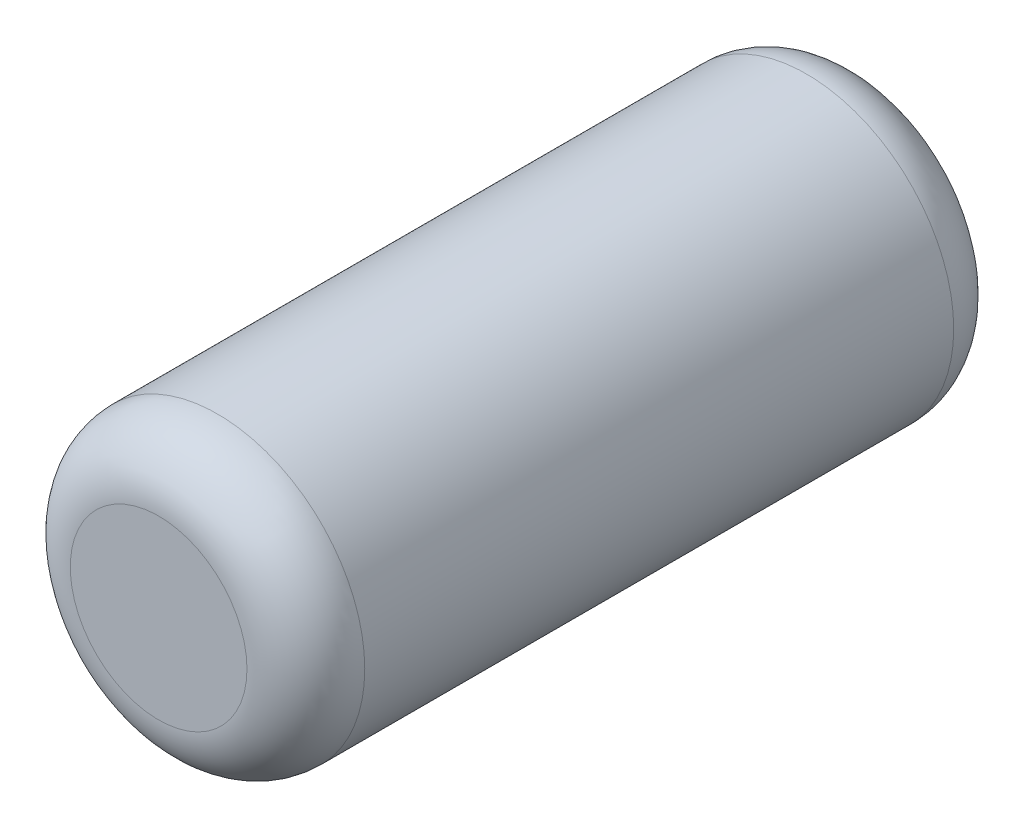
ISO-10303-21;
HEADER;
FILE_DESCRIPTION(('STEP AP214'),'2;1');
FILE_NAME('part.step','',(''),(''),'','','');
FILE_SCHEMA(('AUTOMOTIVE_DESIGN { 1 0 10303 214 1 1 1 1 }'));
ENDSEC;
DATA;
#1=APPLICATION_CONTEXT('core data for automotive mechanical design processes');
#2=APPLICATION_PROTOCOL_DEFINITION('international standard','automotive_design',2000,#1);
#3=PRODUCT_CONTEXT('',#1,'mechanical');
#4=PRODUCT('Part','Part','',(#3));
#5=PRODUCT_RELATED_PRODUCT_CATEGORY('part','',(#4));
#6=PRODUCT_DEFINITION_FORMATION('','',#4);
#7=PRODUCT_DEFINITION_CONTEXT('part definition',#1,'design');
#8=PRODUCT_DEFINITION('design','',#6,#7);
#9=PRODUCT_DEFINITION_SHAPE('','',#8);
#10=(LENGTH_UNIT() NAMED_UNIT(*) SI_UNIT(.MILLI.,.METRE.));
#11=(NAMED_UNIT(*) PLANE_ANGLE_UNIT() SI_UNIT($,.RADIAN.));
#12=(NAMED_UNIT(*) SI_UNIT($,.STERADIAN.) SOLID_ANGLE_UNIT());
#13=UNCERTAINTY_MEASURE_WITH_UNIT(LENGTH_MEASURE(1.E-05),#10,'distance_accuracy_value','');
#14=(GEOMETRIC_REPRESENTATION_CONTEXT(3) GLOBAL_UNCERTAINTY_ASSIGNED_CONTEXT((#13)) GLOBAL_UNIT_ASSIGNED_CONTEXT((#10,
#11,#12)) REPRESENTATION_CONTEXT('',''));
#15=CARTESIAN_POINT('',(0.,0.,0.));
#16=DIRECTION('',(0.,0.,1.));
#17=DIRECTION('',(1.,0.,0.));
#18=AXIS2_PLACEMENT_3D('',#15,#16,#17);
#19=CARTESIAN_POINT('',(0.,0.,-10.2));
#20=DIRECTION('',(0.,0.,1.));
#21=DIRECTION('',(1.,0.,0.));
#22=AXIS2_PLACEMENT_3D('',#19,#20,#21);
#23=CYLINDRICAL_SURFACE('',#22,1.75);
#24=CARTESIAN_POINT('',(0.,0.,-9.5));
#25=DIRECTION('',(0.,0.,1.));
#26=DIRECTION('',(1.,0.,0.));
#27=AXIS2_PLACEMENT_3D('',#24,#25,#26);
#28=CIRCLE('',#27,1.75);
#29=CARTESIAN_POINT('',(1.75,0.,-9.5));
#30=VERTEX_POINT('',#29);
#31=EDGE_CURVE('E49',#30,#30,#28,.T.);
#32=ORIENTED_EDGE('',*,*,#31,.T.);
#33=EDGE_LOOP('',(#32));
#34=FACE_BOUND('',#33,.T.);
#35=CARTESIAN_POINT('',(0.,0.,-2.5));
#36=DIRECTION('',(0.,0.,1.));
#37=DIRECTION('',(1.,0.,0.));
#38=AXIS2_PLACEMENT_3D('',#35,#36,#37);
#39=CIRCLE('',#38,1.75);
#40=CARTESIAN_POINT('',(1.75,0.,-2.5));
#41=VERTEX_POINT('',#40);
#42=EDGE_CURVE('E53',#41,#41,#39,.F.);
#43=ORIENTED_EDGE('',*,*,#42,.T.);
#44=EDGE_LOOP('',(#43));
#45=FACE_BOUND('',#44,.T.);
#46=ADVANCED_FACE('F38',(#34,#45),#23,.T.);
#47=CARTESIAN_POINT('',(0.,0.,-10.2));
#48=DIRECTION('',(0.,0.,1.));
#49=DIRECTION('',(1.,0.,0.));
#50=AXIS2_PLACEMENT_3D('',#47,#48,#49);
#51=PLANE('',#50);
#52=CARTESIAN_POINT('',(0.,0.,-10.2));
#53=DIRECTION('',(0.,0.,1.));
#54=DIRECTION('',(1.,0.,0.));
#55=AXIS2_PLACEMENT_3D('',#52,#53,#54);
#56=CIRCLE('',#55,1.05);
#57=CARTESIAN_POINT('',(1.05,0.,-10.2));
#58=VERTEX_POINT('',#57);
#59=EDGE_CURVE('E45',#58,#58,#56,.F.);
#60=ORIENTED_EDGE('',*,*,#59,.T.);
#61=EDGE_LOOP('',(#60));
#62=FACE_BOUND('',#61,.T.);
#63=ADVANCED_FACE('F69',(#62),#51,.F.);
#64=CARTESIAN_POINT('',(0.,0.,-1.8));
#65=DIRECTION('',(0.,0.,1.));
#66=DIRECTION('',(1.,0.,0.));
#67=AXIS2_PLACEMENT_3D('',#64,#65,#66);
#68=PLANE('',#67);
#69=CARTESIAN_POINT('',(0.,0.,-1.8));
#70=DIRECTION('',(0.,0.,1.));
#71=DIRECTION('',(1.,0.,0.));
#72=AXIS2_PLACEMENT_3D('',#69,#70,#71);
#73=CIRCLE('',#72,1.05);
#74=CARTESIAN_POINT('',(1.05,0.,-1.8));
#75=VERTEX_POINT('',#74);
#76=EDGE_CURVE('E10',#75,#75,#73,.T.);
#77=ORIENTED_EDGE('',*,*,#76,.T.);
#78=EDGE_LOOP('',(#77));
#79=FACE_BOUND('',#78,.T.);
#80=ADVANCED_FACE('F66',(#79),#68,.T.);
#81=CARTESIAN_POINT('',(0.,0.,-9.5));
#82=DIRECTION('',(0.,0.,1.));
#83=DIRECTION('',(1.,0.,0.));
#84=AXIS2_PLACEMENT_3D('',#81,#82,#83);
#85=TOROIDAL_SURFACE('',#84,1.05,0.7);
#86=ORIENTED_EDGE('',*,*,#59,.F.);
#87=EDGE_LOOP('',(#86));
#88=FACE_BOUND('',#87,.T.);
#89=ORIENTED_EDGE('',*,*,#31,.F.);
#90=EDGE_LOOP('',(#89));
#91=FACE_BOUND('',#90,.T.);
#92=ADVANCED_FACE('F62',(#88,#91),#85,.T.);
#93=CARTESIAN_POINT('',(0.,0.,-2.5));
#94=DIRECTION('',(0.,0.,1.));
#95=DIRECTION('',(1.,0.,0.));
#96=AXIS2_PLACEMENT_3D('',#93,#94,#95);
#97=TOROIDAL_SURFACE('',#96,1.05,0.7);
#98=ORIENTED_EDGE('',*,*,#42,.F.);
#99=EDGE_LOOP('',(#98));
#100=FACE_BOUND('',#99,.T.);
#101=ORIENTED_EDGE('',*,*,#76,.F.);
#102=EDGE_LOOP('',(#101));
#103=FACE_BOUND('',#102,.T.);
#104=ADVANCED_FACE('F40',(#100,#103),#97,.T.);
#105=CLOSED_SHELL('',(#46,#63,#80,#92,#104));
#106=MANIFOLD_SOLID_BREP('B2',#105);
#107=ADVANCED_BREP_SHAPE_REPRESENTATION('',(#18,#106),#14);
#108=SHAPE_DEFINITION_REPRESENTATION(#9,#107);
ENDSEC;
END-ISO-10303-21;
